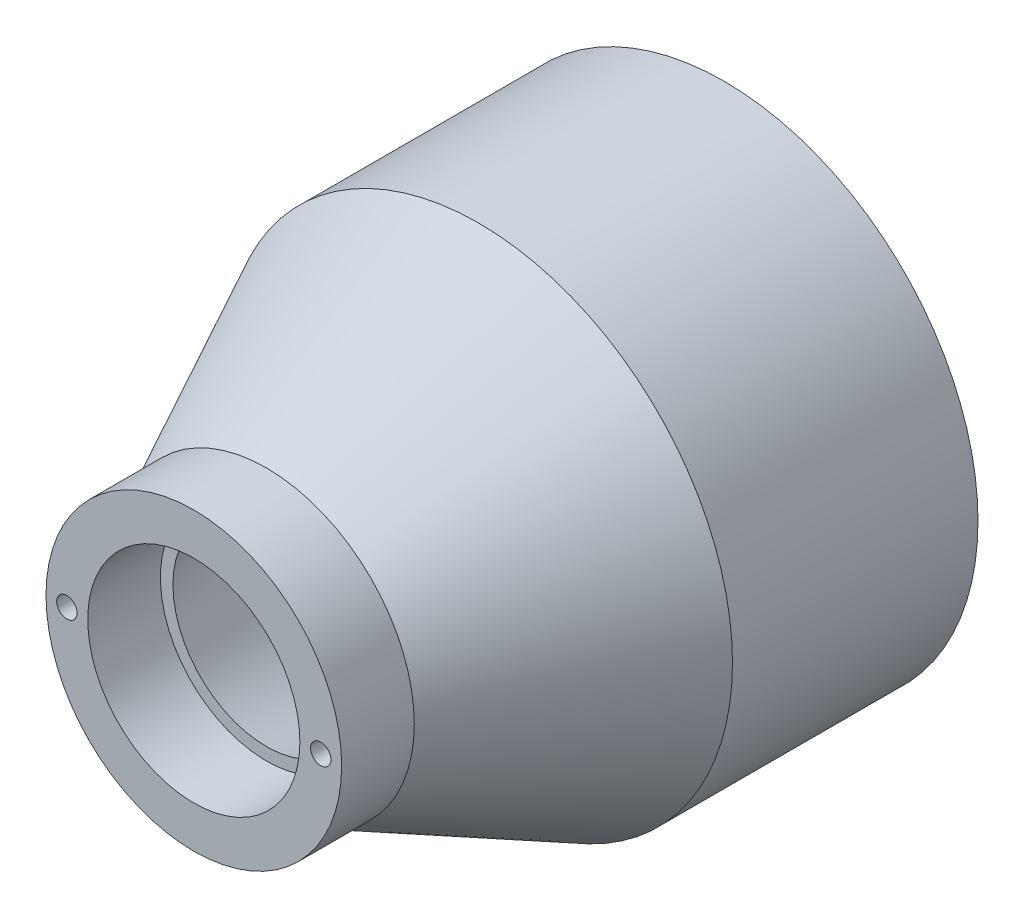
ISO-10303-21;
HEADER;
FILE_DESCRIPTION(('STEP AP214'),'2;1');
FILE_NAME('part.step','',(''),(''),'','','');
FILE_SCHEMA(('AUTOMOTIVE_DESIGN { 1 0 10303 214 1 1 1 1 }'));
ENDSEC;
DATA;
#1=APPLICATION_CONTEXT('core data for automotive mechanical design processes');
#2=APPLICATION_PROTOCOL_DEFINITION('international standard','automotive_design',2000,#1);
#3=PRODUCT_CONTEXT('',#1,'mechanical');
#4=PRODUCT('Part','Part','',(#3));
#5=PRODUCT_RELATED_PRODUCT_CATEGORY('part','',(#4));
#6=PRODUCT_DEFINITION_FORMATION('','',#4);
#7=PRODUCT_DEFINITION_CONTEXT('part definition',#1,'design');
#8=PRODUCT_DEFINITION('design','',#6,#7);
#9=PRODUCT_DEFINITION_SHAPE('','',#8);
#10=(LENGTH_UNIT() NAMED_UNIT(*) SI_UNIT(.MILLI.,.METRE.));
#11=(NAMED_UNIT(*) PLANE_ANGLE_UNIT() SI_UNIT($,.RADIAN.));
#12=(NAMED_UNIT(*) SI_UNIT($,.STERADIAN.) SOLID_ANGLE_UNIT());
#13=UNCERTAINTY_MEASURE_WITH_UNIT(LENGTH_MEASURE(1.E-05),#10,'distance_accuracy_value','');
#14=(GEOMETRIC_REPRESENTATION_CONTEXT(3) GLOBAL_UNCERTAINTY_ASSIGNED_CONTEXT((#13)) GLOBAL_UNIT_ASSIGNED_CONTEXT((#10,
#11,#12)) REPRESENTATION_CONTEXT('',''));
#15=CARTESIAN_POINT('',(0.,0.,0.));
#16=DIRECTION('',(0.,0.,1.));
#17=DIRECTION('',(1.,0.,0.));
#18=AXIS2_PLACEMENT_3D('',#15,#16,#17);
#19=CARTESIAN_POINT('',(0.,0.,-49.8));
#20=DIRECTION('',(0.,0.,-1.));
#21=DIRECTION('',(-1.,0.,0.));
#22=AXIS2_PLACEMENT_3D('',#19,#20,#21);
#23=PLANE('',#22);
#24=CARTESIAN_POINT('',(0.,0.,-49.8));
#25=DIRECTION('',(0.,0.,-1.));
#26=DIRECTION('',(-1.,0.,0.));
#27=AXIS2_PLACEMENT_3D('',#24,#25,#26);
#28=CIRCLE('',#27,22.4000840289282);
#29=CARTESIAN_POINT('',(-22.4000840289282,0.,-49.8));
#30=VERTEX_POINT('',#29);
#31=EDGE_CURVE('E11',#30,#30,#28,.F.);
#32=ORIENTED_EDGE('',*,*,#31,.T.);
#33=EDGE_LOOP('',(#32));
#34=FACE_BOUND('',#33,.T.);
#35=CARTESIAN_POINT('',(0.,0.,-49.8));
#36=DIRECTION('',(0.,0.,-1.));
#37=DIRECTION('',(-1.,0.,0.));
#38=AXIS2_PLACEMENT_3D('',#35,#36,#37);
#39=CIRCLE('',#38,25.4);
#40=CARTESIAN_POINT('',(-25.4,0.,-49.8));
#41=VERTEX_POINT('',#40);
#42=EDGE_CURVE('E87',#41,#41,#39,.T.);
#43=ORIENTED_EDGE('',*,*,#42,.T.);
#44=EDGE_LOOP('',(#43));
#45=FACE_BOUND('',#44,.T.);
#46=ADVANCED_FACE('F45',(#34,#45),#23,.T.);
#47=CARTESIAN_POINT('',(0.,0.,8.7));
#48=DIRECTION('',(0.,0.,1.));
#49=DIRECTION('',(1.,0.,0.));
#50=AXIS2_PLACEMENT_3D('',#47,#48,#49);
#51=PLANE('',#50);
#52=CARTESIAN_POINT('',(-15.2,0.,8.7));
#53=DIRECTION('',(0.,0.,1.));
#54=DIRECTION('',(1.,0.,0.));
#55=AXIS2_PLACEMENT_3D('',#52,#53,#54);
#56=CIRCLE('',#55,1.2192);
#57=CARTESIAN_POINT('',(-13.9808,0.,8.7));
#58=VERTEX_POINT('',#57);
#59=EDGE_CURVE('E96',#58,#58,#56,.T.);
#60=ORIENTED_EDGE('',*,*,#59,.F.);
#61=EDGE_LOOP('',(#60));
#62=FACE_BOUND('',#61,.T.);
#63=CARTESIAN_POINT('',(15.2,0.,8.7));
#64=DIRECTION('',(0.,0.,1.));
#65=DIRECTION('',(1.,0.,0.));
#66=AXIS2_PLACEMENT_3D('',#63,#64,#65);
#67=CIRCLE('',#66,1.2192);
#68=CARTESIAN_POINT('',(16.4192,0.,8.7));
#69=VERTEX_POINT('',#68);
#70=EDGE_CURVE('E102',#69,#69,#67,.T.);
#71=ORIENTED_EDGE('',*,*,#70,.F.);
#72=EDGE_LOOP('',(#71));
#73=FACE_BOUND('',#72,.T.);
#74=CARTESIAN_POINT('',(0.,0.,8.7));
#75=DIRECTION('',(0.,0.,1.));
#76=DIRECTION('',(1.,0.,0.));
#77=AXIS2_PLACEMENT_3D('',#74,#75,#76);
#78=CIRCLE('',#77,17.7);
#79=CARTESIAN_POINT('',(17.7,0.,8.7));
#80=VERTEX_POINT('',#79);
#81=EDGE_CURVE('E115',#80,#80,#78,.T.);
#82=ORIENTED_EDGE('',*,*,#81,.T.);
#83=EDGE_LOOP('',(#82));
#84=FACE_BOUND('',#83,.T.);
#85=CARTESIAN_POINT('',(0.,0.,8.7));
#86=DIRECTION('',(0.,0.,1.));
#87=DIRECTION('',(1.,0.,0.));
#88=AXIS2_PLACEMENT_3D('',#85,#86,#87);
#89=CIRCLE('',#88,12.7);
#90=CARTESIAN_POINT('',(12.7,0.,8.7));
#91=VERTEX_POINT('',#90);
#92=EDGE_CURVE('E112',#91,#91,#89,.T.);
#93=ORIENTED_EDGE('',*,*,#92,.F.);
#94=EDGE_LOOP('',(#93));
#95=FACE_BOUND('',#94,.T.);
#96=ADVANCED_FACE('F158',(#62,#73,#84,#95),#51,.T.);
#97=CARTESIAN_POINT('',(0.,0.,8.7));
#98=DIRECTION('',(0.,0.,-1.));
#99=DIRECTION('',(-1.,0.,0.));
#100=AXIS2_PLACEMENT_3D('',#97,#98,#99);
#101=CYLINDRICAL_SURFACE('',#100,17.7);
#102=ORIENTED_EDGE('',*,*,#81,.F.);
#103=EDGE_LOOP('',(#102));
#104=FACE_BOUND('',#103,.T.);
#105=CARTESIAN_POINT('',(0.,0.,0.));
#106=DIRECTION('',(0.,0.,1.));
#107=DIRECTION('',(1.,0.,0.));
#108=AXIS2_PLACEMENT_3D('',#105,#106,#107);
#109=CIRCLE('',#108,17.7);
#110=CARTESIAN_POINT('',(17.7,0.,0.));
#111=VERTEX_POINT('',#110);
#112=EDGE_CURVE('E111',#111,#111,#109,.T.);
#113=ORIENTED_EDGE('',*,*,#112,.T.);
#114=EDGE_LOOP('',(#113));
#115=FACE_BOUND('',#114,.T.);
#116=ADVANCED_FACE('F164',(#104,#115),#101,.T.);
#117=CARTESIAN_POINT('',(0.,0.,8.7));
#118=DIRECTION('',(0.,0.,-1.));
#119=DIRECTION('',(-1.,0.,0.));
#120=AXIS2_PLACEMENT_3D('',#117,#118,#119);
#121=CYLINDRICAL_SURFACE('',#120,12.7);
#122=ORIENTED_EDGE('',*,*,#92,.T.);
#123=EDGE_LOOP('',(#122));
#124=FACE_BOUND('',#123,.T.);
#125=CARTESIAN_POINT('',(0.,0.,0.));
#126=DIRECTION('',(0.,0.,1.));
#127=DIRECTION('',(1.,0.,0.));
#128=AXIS2_PLACEMENT_3D('',#125,#126,#127);
#129=CIRCLE('',#128,12.7);
#130=CARTESIAN_POINT('',(12.7,0.,0.));
#131=VERTEX_POINT('',#130);
#132=EDGE_CURVE('E116',#131,#131,#129,.T.);
#133=ORIENTED_EDGE('',*,*,#132,.F.);
#134=EDGE_LOOP('',(#133));
#135=FACE_BOUND('',#134,.T.);
#136=ADVANCED_FACE('F174',(#124,#135),#121,.F.);
#137=CARTESIAN_POINT('',(0.,0.,0.));
#138=DIRECTION('',(0.,0.,-1.));
#139=DIRECTION('',(-1.,0.,0.));
#140=AXIS2_PLACEMENT_3D('',#137,#138,#139);
#141=PLANE('',#140);
#142=CARTESIAN_POINT('',(0.,0.,0.));
#143=DIRECTION('',(0.,0.,-1.));
#144=DIRECTION('',(-1.,0.,0.));
#145=AXIS2_PLACEMENT_3D('',#142,#143,#144);
#146=CIRCLE('',#145,11.2);
#147=CARTESIAN_POINT('',(-11.2000000000002,0.,0.));
#148=VERTEX_POINT('',#147);
#149=EDGE_CURVE('E108',#148,#148,#146,.T.);
#150=ORIENTED_EDGE('',*,*,#149,.T.);
#151=EDGE_LOOP('',(#150));
#152=FACE_BOUND('',#151,.T.);
#153=ORIENTED_EDGE('',*,*,#132,.T.);
#154=EDGE_LOOP('',(#153));
#155=FACE_BOUND('',#154,.T.);
#156=ADVANCED_FACE('F172',(#152,#155),#141,.F.);
#157=CARTESIAN_POINT('',(0.,0.,0.));
#158=DIRECTION('',(0.,0.,-1.));
#159=DIRECTION('',(-1.,0.,0.));
#160=AXIS2_PLACEMENT_3D('',#157,#158,#159);
#161=CIRCLE('',#160,17.7000283593576);
#162=CARTESIAN_POINT('',(-17.7000283593576,0.,0.));
#163=VERTEX_POINT('',#162);
#164=EDGE_CURVE('E54',#163,#163,#161,.F.);
#165=ORIENTED_EDGE('',*,*,#164,.T.);
#166=EDGE_LOOP('',(#165));
#167=FACE_BOUND('',#166,.T.);
#168=ORIENTED_EDGE('',*,*,#112,.F.);
#169=EDGE_LOOP('',(#168));
#170=FACE_BOUND('',#169,.T.);
#171=ADVANCED_FACE('F128',(#167,#170),#141,.F.);
#172=CARTESIAN_POINT('',(0.,0.,-49.8));
#173=DIRECTION('',(0.,0.,1.));
#174=DIRECTION('',(1.,0.,0.));
#175=AXIS2_PLACEMENT_3D('',#172,#173,#174);
#176=CYLINDRICAL_SURFACE('',#175,30.4);
#177=CARTESIAN_POINT('',(0.,0.,-25.4000000000002));
#178=DIRECTION('',(0.,0.,-1.));
#179=DIRECTION('',(-1.,0.,0.));
#180=AXIS2_PLACEMENT_3D('',#177,#178,#179);
#181=CIRCLE('',#180,30.4);
#182=CARTESIAN_POINT('',(-30.4,0.,-25.4000000000002));
#183=VERTEX_POINT('',#182);
#184=EDGE_CURVE('E121',#183,#183,#181,.T.);
#185=ORIENTED_EDGE('',*,*,#184,.T.);
#186=EDGE_LOOP('',(#185));
#187=FACE_BOUND('',#186,.T.);
#188=CARTESIAN_POINT('',(0.,0.,-54.8));
#189=DIRECTION('',(0.,0.,-1.));
#190=DIRECTION('',(-1.,0.,0.));
#191=AXIS2_PLACEMENT_3D('',#188,#189,#190);
#192=CIRCLE('',#191,30.4);
#193=CARTESIAN_POINT('',(-30.4,0.,-54.8));
#194=VERTEX_POINT('',#193);
#195=EDGE_CURVE('E91',#194,#194,#192,.T.);
#196=ORIENTED_EDGE('',*,*,#195,.F.);
#197=EDGE_LOOP('',(#196));
#198=FACE_BOUND('',#197,.T.);
#199=ADVANCED_FACE('F134',(#187,#198),#176,.T.);
#200=CARTESIAN_POINT('',(0.,0.,-25.4000000000002));
#201=DIRECTION('',(0.,0.,-1.));
#202=DIRECTION('',(-1.,0.,0.));
#203=AXIS2_PLACEMENT_3D('',#200,#201,#202);
#204=CONICAL_SURFACE('',#203,30.4,0.463646715792291);
#205=ORIENTED_EDGE('',*,*,#164,.F.);
#206=EDGE_LOOP('',(#205));
#207=FACE_BOUND('',#206,.T.);
#208=ORIENTED_EDGE('',*,*,#184,.F.);
#209=EDGE_LOOP('',(#208));
#210=FACE_BOUND('',#209,.T.);
#211=ADVANCED_FACE('F131',(#207,#210),#204,.T.);
#212=CARTESIAN_POINT('',(0.,0.,7.63278329429795E-13));
#213=DIRECTION('',(0.,0.,-1.));
#214=DIRECTION('',(-1.,0.,0.));
#215=AXIS2_PLACEMENT_3D('',#212,#213,#214);
#216=CONICAL_SURFACE('',#215,11.2,0.221220482690278);
#217=CARTESIAN_POINT('',(-22.4000840289282,0.,-49.8));
#218=CARTESIAN_POINT('',(-22.2834164869602,0.,-49.28125));
#219=CARTESIAN_POINT('',(-22.1667489449922,0.,-48.7625));
#220=CARTESIAN_POINT('',(-21.9334138610562,0.,-47.725));
#221=CARTESIAN_POINT('',(-21.8167463190882,0.,-47.20625));
#222=CARTESIAN_POINT('',(-21.5834112351522,0.,-46.16875));
#223=CARTESIAN_POINT('',(-21.4667436931842,0.,-45.65));
#224=CARTESIAN_POINT('',(-21.2334086092482,0.,-44.6125));
#225=CARTESIAN_POINT('',(-21.1167410672802,0.,-44.09375));
#226=CARTESIAN_POINT('',(-20.8834059833442,0.,-43.05625));
#227=CARTESIAN_POINT('',(-20.7667384413762,0.,-42.5375));
#228=CARTESIAN_POINT('',(-20.5334033574402,0.,-41.5));
#229=CARTESIAN_POINT('',(-20.4167358154722,0.,-40.98125));
#230=CARTESIAN_POINT('',(-20.1834007315362,0.,-39.94375));
#231=CARTESIAN_POINT('',(-20.0667331895682,0.,-39.425));
#232=CARTESIAN_POINT('',(-19.8333981056322,0.,-38.3875));
#233=CARTESIAN_POINT('',(-19.7167305636642,0.,-37.86875));
#234=CARTESIAN_POINT('',(-19.4833954797282,0.,-36.83125));
#235=CARTESIAN_POINT('',(-19.3667279377602,0.,-36.3125));
#236=CARTESIAN_POINT('',(-19.1333928538242,0.,-35.275));
#237=CARTESIAN_POINT('',(-19.0167253118562,0.,-34.75625));
#238=CARTESIAN_POINT('',(-18.7833902279202,0.,-33.71875));
#239=CARTESIAN_POINT('',(-18.6667226859522,0.,-33.2));
#240=CARTESIAN_POINT('',(-18.4333876020162,0.,-32.1625));
#241=CARTESIAN_POINT('',(-18.3167200600482,0.,-31.64375));
#242=CARTESIAN_POINT('',(-18.0833849761122,0.,-30.60625));
#243=CARTESIAN_POINT('',(-17.9667174341442,0.,-30.0875));
#244=CARTESIAN_POINT('',(-17.7333823502082,0.,-29.05));
#245=CARTESIAN_POINT('',(-17.6167148082402,0.,-28.53125));
#246=CARTESIAN_POINT('',(-17.3833797243042,0.,-27.49375));
#247=CARTESIAN_POINT('',(-17.2667121823362,0.,-26.975));
#248=CARTESIAN_POINT('',(-17.0333770984002,0.,-25.9375));
#249=CARTESIAN_POINT('',(-16.9167095564322,0.,-25.41875));
#250=CARTESIAN_POINT('',(-16.6833744724962,0.,-24.38125));
#251=CARTESIAN_POINT('',(-16.5667069305282,0.,-23.8625));
#252=CARTESIAN_POINT('',(-16.3333718465922,0.,-22.825));
#253=CARTESIAN_POINT('',(-16.2167043046242,0.,-22.30625));
#254=CARTESIAN_POINT('',(-15.9833692206882,0.,-21.26875));
#255=CARTESIAN_POINT('',(-15.8667016787202,0.,-20.75));
#256=CARTESIAN_POINT('',(-15.6333665947842,0.,-19.7125));
#257=CARTESIAN_POINT('',(-15.5166990528162,0.,-19.19375));
#258=CARTESIAN_POINT('',(-15.2833639688802,0.,-18.15625));
#259=CARTESIAN_POINT('',(-15.1666964269122,0.,-17.6375));
#260=CARTESIAN_POINT('',(-14.9333613429762,0.,-16.6));
#261=CARTESIAN_POINT('',(-14.8166938010082,0.,-16.08125));
#262=CARTESIAN_POINT('',(-14.5833587170722,0.,-15.04375));
#263=CARTESIAN_POINT('',(-14.4666911751042,0.,-14.525));
#264=CARTESIAN_POINT('',(-14.2333560911682,0.,-13.4875));
#265=CARTESIAN_POINT('',(-14.1166885492002,0.,-12.96875));
#266=CARTESIAN_POINT('',(-13.8833534652642,0.,-11.93125));
#267=CARTESIAN_POINT('',(-13.7666859232962,0.,-11.4125));
#268=CARTESIAN_POINT('',(-13.5333508393602,0.,-10.375));
#269=CARTESIAN_POINT('',(-13.4166832973922,0.,-9.85625));
#270=CARTESIAN_POINT('',(-13.1833482134562,0.,-8.81875));
#271=CARTESIAN_POINT('',(-13.0666806714882,0.,-8.3));
#272=CARTESIAN_POINT('',(-12.8333455875522,0.,-7.2625));
#273=CARTESIAN_POINT('',(-12.7166780455842,0.,-6.74375));
#274=CARTESIAN_POINT('',(-12.4833429616482,0.,-5.70625));
#275=CARTESIAN_POINT('',(-12.3666754196802,0.,-5.1875));
#276=CARTESIAN_POINT('',(-12.1333403357442,0.,-4.15));
#277=CARTESIAN_POINT('',(-12.0166727937762,0.,-3.63125));
#278=CARTESIAN_POINT('',(-11.7833377098402,0.,-2.59375));
#279=CARTESIAN_POINT('',(-11.6666701678722,0.,-2.075));
#280=CARTESIAN_POINT('',(-11.4333350839362,0.,-1.0375));
#281=CARTESIAN_POINT('',(-11.3166675419682,0.,-0.518750000000001));
#282=CARTESIAN_POINT('',(-11.2000000000002,0.,0.));
#283=B_SPLINE_CURVE_WITH_KNOTS('',3,(#217,#218,#219,#220,#221,#222,#223,#224,#225,#226,#227,
#228,#229,#230,#231,#232,#233,#234,#235,#236,#237,#238,#239,#240,#241,#242,#243,#244,#245,#246,
#247,#248,#249,#250,#251,#252,#253,#254,#255,#256,#257,#258,#259,#260,#261,#262,#263,#264,#265,
#266,#267,#268,#269,#270,#271,#272,#273,#274,#275,#276,#277,#278,#279,#280,#281,#282),
.UNSPECIFIED.,.F.,.F.,(4,2,2,2,2,2,2,2,2,2,2,2,2,2,2,2,2,2,2,2,2,2,2,2,2,2,2,2,2,2,2,2,4),(0.,
1.59512253467867,3.19024506935733,4.785367604036,6.38049013871467,7.97561267339334,
9.570735208072,11.1658577427507,12.7609802774293,14.356102812108,15.9512253467867,
17.5463478814653,19.141470416144,20.7365929508227,22.3317154855013,23.92683802018,
25.5219605548587,27.1170830895373,28.712205624216,30.3073281588947,31.9024506935733,
33.497573228252,35.0926957629307,36.6878182976093,38.282940832288,39.8780633669667,
41.4731859016453,43.068308436324,44.6634309710026,46.2585535056813,47.85367604036,
49.4487985750386,51.0439211097173),.UNSPECIFIED.);
#284=EDGE_CURVE('BSEAM48',#30,#148,#283,.T.);
#285=ORIENTED_EDGE('',*,*,#31,.F.);
#286=ORIENTED_EDGE('',*,*,#149,.F.);
#287=ORIENTED_EDGE('',*,*,#284,.T.);
#288=ORIENTED_EDGE('',*,*,#284,.F.);
#289=EDGE_LOOP('',(#285,#287,#286,#288));
#290=FACE_BOUND('',#289,.T.);
#291=ADVANCED_FACE('F48',(#290),#216,.F.);
#292=CARTESIAN_POINT('',(15.2,0.,3.7));
#293=DIRECTION('',(0.,0.,1.));
#294=DIRECTION('',(1.,0.,0.));
#295=AXIS2_PLACEMENT_3D('',#292,#293,#294);
#296=CONICAL_SURFACE('',#295,1.2192,1.02974425867665);
#297=CARTESIAN_POINT('',(15.2,0.,2.9674307332816));
#298=VERTEX_POINT('',#297);
#299=VERTEX_LOOP('',#298);
#300=FACE_BOUND('',#299,.T.);
#301=CARTESIAN_POINT('',(15.2,0.,3.7));
#302=DIRECTION('',(0.,0.,1.));
#303=DIRECTION('',(1.,0.,0.));
#304=AXIS2_PLACEMENT_3D('',#301,#302,#303);
#305=CIRCLE('',#304,1.2192);
#306=CARTESIAN_POINT('',(16.4192,0.,3.7));
#307=VERTEX_POINT('',#306);
#308=EDGE_CURVE('E105',#307,#307,#305,.T.);
#309=ORIENTED_EDGE('',*,*,#308,.T.);
#310=EDGE_LOOP('',(#309));
#311=FACE_BOUND('',#310,.T.);
#312=ADVANCED_FACE('F169',(#300,#311),#296,.F.);
#313=CARTESIAN_POINT('',(15.2,0.,8.7));
#314=DIRECTION('',(0.,0.,1.));
#315=DIRECTION('',(1.,0.,0.));
#316=AXIS2_PLACEMENT_3D('',#313,#314,#315);
#317=CYLINDRICAL_SURFACE('',#316,1.2192);
#318=ORIENTED_EDGE('',*,*,#308,.F.);
#319=EDGE_LOOP('',(#318));
#320=FACE_BOUND('',#319,.T.);
#321=ORIENTED_EDGE('',*,*,#70,.T.);
#322=EDGE_LOOP('',(#321));
#323=FACE_BOUND('',#322,.T.);
#324=ADVANCED_FACE('F207',(#320,#323),#317,.F.);
#325=CARTESIAN_POINT('',(-15.2,0.,3.7));
#326=DIRECTION('',(0.,0.,1.));
#327=DIRECTION('',(1.,0.,0.));
#328=AXIS2_PLACEMENT_3D('',#325,#326,#327);
#329=CONICAL_SURFACE('',#328,1.2192,1.02974425867665);
#330=CARTESIAN_POINT('',(-15.2,0.,2.9674307332816));
#331=VERTEX_POINT('',#330);
#332=VERTEX_LOOP('',#331);
#333=FACE_BOUND('',#332,.T.);
#334=CARTESIAN_POINT('',(-15.2,0.,3.7));
#335=DIRECTION('',(0.,0.,1.));
#336=DIRECTION('',(1.,0.,0.));
#337=AXIS2_PLACEMENT_3D('',#334,#335,#336);
#338=CIRCLE('',#337,1.2192);
#339=CARTESIAN_POINT('',(-13.9808,0.,3.7));
#340=VERTEX_POINT('',#339);
#341=EDGE_CURVE('E99',#340,#340,#338,.T.);
#342=ORIENTED_EDGE('',*,*,#341,.T.);
#343=EDGE_LOOP('',(#342));
#344=FACE_BOUND('',#343,.T.);
#345=ADVANCED_FACE('F212',(#333,#344),#329,.F.);
#346=CARTESIAN_POINT('',(-15.2,0.,8.7));
#347=DIRECTION('',(0.,0.,1.));
#348=DIRECTION('',(1.,0.,0.));
#349=AXIS2_PLACEMENT_3D('',#346,#347,#348);
#350=CYLINDRICAL_SURFACE('',#349,1.2192);
#351=ORIENTED_EDGE('',*,*,#341,.F.);
#352=EDGE_LOOP('',(#351));
#353=FACE_BOUND('',#352,.T.);
#354=ORIENTED_EDGE('',*,*,#59,.T.);
#355=EDGE_LOOP('',(#354));
#356=FACE_BOUND('',#355,.T.);
#357=ADVANCED_FACE('F146',(#353,#356),#350,.F.);
#358=CARTESIAN_POINT('',(0.,0.,-54.8));
#359=DIRECTION('',(0.,0.,-1.));
#360=DIRECTION('',(-1.,0.,0.));
#361=AXIS2_PLACEMENT_3D('',#358,#359,#360);
#362=PLANE('',#361);
#363=CARTESIAN_POINT('',(0.,-27.9,-54.8));
#364=DIRECTION('',(0.,0.,-1.));
#365=DIRECTION('',(-1.,0.,0.));
#366=AXIS2_PLACEMENT_3D('',#363,#364,#365);
#367=CIRCLE('',#366,1.2192);
#368=CARTESIAN_POINT('',(-1.2192,-27.9,-54.8));
#369=VERTEX_POINT('',#368);
#370=EDGE_CURVE('E76',#369,#369,#367,.T.);
#371=ORIENTED_EDGE('',*,*,#370,.F.);
#372=EDGE_LOOP('',(#371));
#373=FACE_BOUND('',#372,.T.);
#374=CARTESIAN_POINT('',(0.,27.9,-54.8));
#375=DIRECTION('',(0.,0.,-1.));
#376=DIRECTION('',(-1.,0.,0.));
#377=AXIS2_PLACEMENT_3D('',#374,#375,#376);
#378=CIRCLE('',#377,1.2192);
#379=CARTESIAN_POINT('',(-1.2192,27.9,-54.8));
#380=VERTEX_POINT('',#379);
#381=EDGE_CURVE('E84',#380,#380,#378,.T.);
#382=ORIENTED_EDGE('',*,*,#381,.F.);
#383=EDGE_LOOP('',(#382));
#384=FACE_BOUND('',#383,.T.);
#385=ORIENTED_EDGE('',*,*,#195,.T.);
#386=EDGE_LOOP('',(#385));
#387=FACE_BOUND('',#386,.T.);
#388=CARTESIAN_POINT('',(0.,0.,-54.8));
#389=DIRECTION('',(0.,0.,-1.));
#390=DIRECTION('',(-1.,0.,0.));
#391=AXIS2_PLACEMENT_3D('',#388,#389,#390);
#392=CIRCLE('',#391,25.4);
#393=CARTESIAN_POINT('',(-25.4,0.,-54.8));
#394=VERTEX_POINT('',#393);
#395=EDGE_CURVE('E88',#394,#394,#392,.T.);
#396=ORIENTED_EDGE('',*,*,#395,.F.);
#397=EDGE_LOOP('',(#396));
#398=FACE_BOUND('',#397,.T.);
#399=ADVANCED_FACE('F142',(#373,#384,#387,#398),#362,.T.);
#400=CARTESIAN_POINT('',(0.,0.,-54.8));
#401=DIRECTION('',(0.,0.,1.));
#402=DIRECTION('',(1.,0.,0.));
#403=AXIS2_PLACEMENT_3D('',#400,#401,#402);
#404=CYLINDRICAL_SURFACE('',#403,25.4);
#405=ORIENTED_EDGE('',*,*,#395,.T.);
#406=EDGE_LOOP('',(#405));
#407=FACE_BOUND('',#406,.T.);
#408=ORIENTED_EDGE('',*,*,#42,.F.);
#409=EDGE_LOOP('',(#408));
#410=FACE_BOUND('',#409,.T.);
#411=ADVANCED_FACE('F145',(#407,#410),#404,.F.);
#412=CARTESIAN_POINT('',(0.,27.9,-54.8));
#413=DIRECTION('',(0.,0.,-1.));
#414=DIRECTION('',(-1.,0.,0.));
#415=AXIS2_PLACEMENT_3D('',#412,#413,#414);
#416=CYLINDRICAL_SURFACE('',#415,1.2192);
#417=CARTESIAN_POINT('',(0.,27.9,-49.72));
#418=DIRECTION('',(0.,0.,-1.));
#419=DIRECTION('',(-1.,0.,0.));
#420=AXIS2_PLACEMENT_3D('',#417,#418,#419);
#421=CIRCLE('',#420,1.2192);
#422=CARTESIAN_POINT('',(-1.2192,27.9,-49.72));
#423=VERTEX_POINT('',#422);
#424=EDGE_CURVE('E79',#423,#423,#421,.T.);
#425=ORIENTED_EDGE('',*,*,#424,.F.);
#426=EDGE_LOOP('',(#425));
#427=FACE_BOUND('',#426,.T.);
#428=ORIENTED_EDGE('',*,*,#381,.T.);
#429=EDGE_LOOP('',(#428));
#430=FACE_BOUND('',#429,.T.);
#431=ADVANCED_FACE('F153',(#427,#430),#416,.F.);
#432=CARTESIAN_POINT('',(0.,27.9,-49.72));
#433=DIRECTION('',(0.,0.,-1.));
#434=DIRECTION('',(-1.,0.,0.));
#435=AXIS2_PLACEMENT_3D('',#432,#433,#434);
#436=CONICAL_SURFACE('',#435,1.2192,1.02974425867666);
#437=CARTESIAN_POINT('',(0.,27.9,-48.9874307332816));
#438=VERTEX_POINT('',#437);
#439=VERTEX_LOOP('',#438);
#440=FACE_BOUND('',#439,.T.);
#441=ORIENTED_EDGE('',*,*,#424,.T.);
#442=EDGE_LOOP('',(#441));
#443=FACE_BOUND('',#442,.T.);
#444=ADVANCED_FACE('F229',(#440,#443),#436,.F.);
#445=CARTESIAN_POINT('',(0.,-27.9,-54.8));
#446=DIRECTION('',(0.,0.,-1.));
#447=DIRECTION('',(-1.,0.,0.));
#448=AXIS2_PLACEMENT_3D('',#445,#446,#447);
#449=CYLINDRICAL_SURFACE('',#448,1.2192);
#450=CARTESIAN_POINT('',(0.,-27.9,-49.72));
#451=DIRECTION('',(0.,0.,-1.));
#452=DIRECTION('',(-1.,0.,0.));
#453=AXIS2_PLACEMENT_3D('',#450,#451,#452);
#454=CIRCLE('',#453,1.2192);
#455=CARTESIAN_POINT('',(-1.2192,-27.9,-49.72));
#456=VERTEX_POINT('',#455);
#457=EDGE_CURVE('E74',#456,#456,#454,.T.);
#458=ORIENTED_EDGE('',*,*,#457,.F.);
#459=EDGE_LOOP('',(#458));
#460=FACE_BOUND('',#459,.T.);
#461=ORIENTED_EDGE('',*,*,#370,.T.);
#462=EDGE_LOOP('',(#461));
#463=FACE_BOUND('',#462,.T.);
#464=ADVANCED_FACE('F70',(#460,#463),#449,.F.);
#465=CARTESIAN_POINT('',(0.,-27.9,-49.72));
#466=DIRECTION('',(0.,0.,-1.));
#467=DIRECTION('',(-1.,0.,0.));
#468=AXIS2_PLACEMENT_3D('',#465,#466,#467);
#469=CONICAL_SURFACE('',#468,1.2192,1.02974425867666);
#470=CARTESIAN_POINT('',(0.,-27.9,-48.9874307332816));
#471=VERTEX_POINT('',#470);
#472=VERTEX_LOOP('',#471);
#473=FACE_BOUND('',#472,.T.);
#474=ORIENTED_EDGE('',*,*,#457,.T.);
#475=EDGE_LOOP('',(#474));
#476=FACE_BOUND('',#475,.T.);
#477=ADVANCED_FACE('F67',(#473,#476),#469,.F.);
#478=CLOSED_SHELL('',(#46,#96,#116,#136,#156,#171,#199,#211,#291,#312,#324,#345,#357,#399,#411,
#431,#444,#464,#477));
#479=MANIFOLD_SOLID_BREP('B2',#478);
#480=ADVANCED_BREP_SHAPE_REPRESENTATION('',(#18,#479),#14);
#481=SHAPE_DEFINITION_REPRESENTATION(#9,#480);
ENDSEC;
END-ISO-10303-21;
